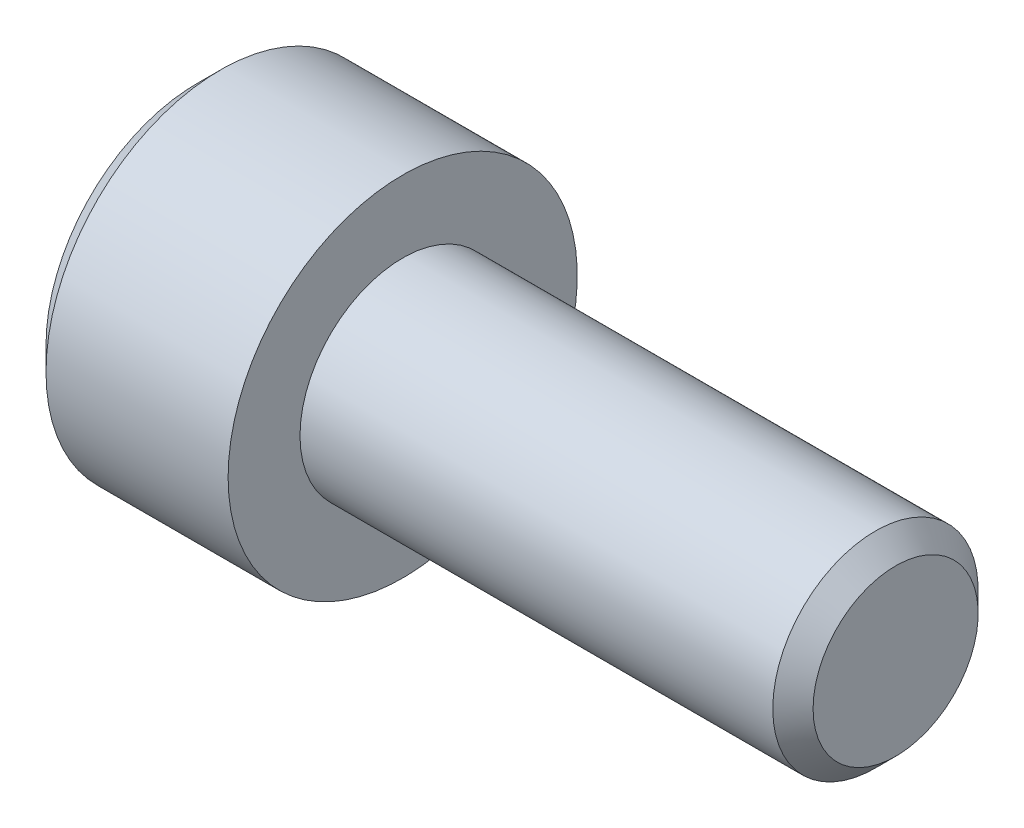
ISO-10303-21;
HEADER;
FILE_DESCRIPTION(('STEP AP214'),'2;1');
FILE_NAME('part.step','',(''),(''),'','','');
FILE_SCHEMA(('AUTOMOTIVE_DESIGN { 1 0 10303 214 1 1 1 1 }'));
ENDSEC;
DATA;
#1=APPLICATION_CONTEXT('core data for automotive mechanical design processes');
#2=APPLICATION_PROTOCOL_DEFINITION('international standard','automotive_design',2000,#1);
#3=PRODUCT_CONTEXT('',#1,'mechanical');
#4=PRODUCT('Part','Part','',(#3));
#5=PRODUCT_RELATED_PRODUCT_CATEGORY('part','',(#4));
#6=PRODUCT_DEFINITION_FORMATION('','',#4);
#7=PRODUCT_DEFINITION_CONTEXT('part definition',#1,'design');
#8=PRODUCT_DEFINITION('design','',#6,#7);
#9=PRODUCT_DEFINITION_SHAPE('','',#8);
#10=(LENGTH_UNIT() NAMED_UNIT(*) SI_UNIT(.MILLI.,.METRE.));
#11=(NAMED_UNIT(*) PLANE_ANGLE_UNIT() SI_UNIT($,.RADIAN.));
#12=(NAMED_UNIT(*) SI_UNIT($,.STERADIAN.) SOLID_ANGLE_UNIT());
#13=UNCERTAINTY_MEASURE_WITH_UNIT(LENGTH_MEASURE(1.E-05),#10,'distance_accuracy_value','');
#14=(GEOMETRIC_REPRESENTATION_CONTEXT(3) GLOBAL_UNCERTAINTY_ASSIGNED_CONTEXT((#13)) GLOBAL_UNIT_ASSIGNED_CONTEXT((#10,
#11,#12)) REPRESENTATION_CONTEXT('',''));
#15=CARTESIAN_POINT('',(0.,0.,0.));
#16=DIRECTION('',(0.,0.,1.));
#17=DIRECTION('',(1.,0.,0.));
#18=AXIS2_PLACEMENT_3D('',#15,#16,#17);
#19=CARTESIAN_POINT('',(-5.,0.,0.));
#20=DIRECTION('',(1.,0.,0.));
#21=DIRECTION('',(0.,0.,-1.));
#22=AXIS2_PLACEMENT_3D('',#19,#20,#21);
#23=PLANE('',#22);
#24=CARTESIAN_POINT('',(-5.,0.,0.));
#25=DIRECTION('',(-1.,0.,0.));
#26=DIRECTION('',(0.,0.,1.));
#27=AXIS2_PLACEMENT_3D('',#24,#25,#26);
#28=CIRCLE('',#27,3.68333333333333);
#29=CARTESIAN_POINT('',(-5.,0.,3.68333333333333));
#30=VERTEX_POINT('',#29);
#31=EDGE_CURVE('E11',#30,#30,#28,.T.);
#32=ORIENTED_EDGE('',*,*,#31,.T.);
#33=EDGE_LOOP('',(#32));
#34=FACE_BOUND('',#33,.T.);
#35=DIRECTION('',(0.,-0.5,-0.866025403784439));
#36=VECTOR('',#35,1.);
#37=CARTESIAN_POINT('',(-5.,-1.15470053837925,2.));
#38=LINE('',#37,#36);
#39=CARTESIAN_POINT('',(-5.,-1.15470053837925,2.));
#40=VERTEX_POINT('',#39);
#41=CARTESIAN_POINT('',(-5.,-2.3094010767585,0.));
#42=VERTEX_POINT('',#41);
#43=EDGE_CURVE('E202',#40,#42,#38,.T.);
#44=ORIENTED_EDGE('',*,*,#43,.T.);
#45=DIRECTION('',(0.,0.5,-0.866025403784439));
#46=VECTOR('',#45,1.);
#47=CARTESIAN_POINT('',(-5.,-2.3094010767585,0.));
#48=LINE('',#47,#46);
#49=CARTESIAN_POINT('',(-5.,-1.15470053837925,-2.));
#50=VERTEX_POINT('',#49);
#51=EDGE_CURVE('E205',#42,#50,#48,.T.);
#52=ORIENTED_EDGE('',*,*,#51,.T.);
#53=DIRECTION('',(0.,1.,0.));
#54=VECTOR('',#53,1.);
#55=CARTESIAN_POINT('',(-5.,-1.15470053837925,-2.));
#56=LINE('',#55,#54);
#57=CARTESIAN_POINT('',(-5.,1.15470053837925,-2.));
#58=VERTEX_POINT('',#57);
#59=EDGE_CURVE('E217',#50,#58,#56,.T.);
#60=ORIENTED_EDGE('',*,*,#59,.T.);
#61=DIRECTION('',(0.,0.5,0.866025403784439));
#62=VECTOR('',#61,1.);
#63=CARTESIAN_POINT('',(-5.,1.15470053837925,-2.));
#64=LINE('',#63,#62);
#65=CARTESIAN_POINT('',(-5.,2.3094010767585,0.));
#66=VERTEX_POINT('',#65);
#67=EDGE_CURVE('E119',#58,#66,#64,.T.);
#68=ORIENTED_EDGE('',*,*,#67,.T.);
#69=DIRECTION('',(0.,-0.5,0.866025403784439));
#70=VECTOR('',#69,1.);
#71=CARTESIAN_POINT('',(-5.,2.3094010767585,0.));
#72=LINE('',#71,#70);
#73=CARTESIAN_POINT('',(-5.,1.15470053837925,2.));
#74=VERTEX_POINT('',#73);
#75=EDGE_CURVE('E241',#66,#74,#72,.T.);
#76=ORIENTED_EDGE('',*,*,#75,.T.);
#77=DIRECTION('',(0.,-1.,0.));
#78=VECTOR('',#77,1.);
#79=CARTESIAN_POINT('',(-5.,1.15470053837925,2.));
#80=LINE('',#79,#78);
#81=EDGE_CURVE('E134',#74,#40,#80,.T.);
#82=ORIENTED_EDGE('',*,*,#81,.T.);
#83=EDGE_LOOP('',(#44,#52,#60,#68,#76,#82));
#84=FACE_BOUND('',#83,.T.);
#85=ADVANCED_FACE('F36',(#34,#84),#23,.F.);
#86=CARTESIAN_POINT('',(-4.43333333333333,0.,0.));
#87=DIRECTION('',(1.,0.,0.));
#88=DIRECTION('',(0.,0.,-1.));
#89=AXIS2_PLACEMENT_3D('',#86,#87,#88);
#90=CONICAL_SURFACE('',#89,4.25,0.785398163397448);
#91=ORIENTED_EDGE('',*,*,#31,.F.);
#92=EDGE_LOOP('',(#91));
#93=FACE_BOUND('',#92,.T.);
#94=CARTESIAN_POINT('',(-4.43333333333333,0.,0.));
#95=DIRECTION('',(-1.,0.,0.));
#96=DIRECTION('',(0.,0.,1.));
#97=AXIS2_PLACEMENT_3D('',#94,#95,#96);
#98=CIRCLE('',#97,4.25);
#99=CARTESIAN_POINT('',(-4.43333333333333,0.,4.25));
#100=VERTEX_POINT('',#99);
#101=EDGE_CURVE('E43',#100,#100,#98,.T.);
#102=ORIENTED_EDGE('',*,*,#101,.T.);
#103=EDGE_LOOP('',(#102));
#104=FACE_BOUND('',#103,.T.);
#105=ADVANCED_FACE('F159',(#93,#104),#90,.T.);
#106=CARTESIAN_POINT('',(12.,0.,0.));
#107=DIRECTION('',(-1.,0.,0.));
#108=DIRECTION('',(0.,0.,1.));
#109=AXIS2_PLACEMENT_3D('',#106,#107,#108);
#110=CYLINDRICAL_SURFACE('',#109,4.25);
#111=ORIENTED_EDGE('',*,*,#101,.F.);
#112=EDGE_LOOP('',(#111));
#113=FACE_BOUND('',#112,.T.);
#114=CARTESIAN_POINT('',(0.,0.,0.));
#115=DIRECTION('',(-1.,0.,0.));
#116=DIRECTION('',(0.,0.,1.));
#117=AXIS2_PLACEMENT_3D('',#114,#115,#116);
#118=CIRCLE('',#117,4.25);
#119=CARTESIAN_POINT('',(0.,0.,4.25));
#120=VERTEX_POINT('',#119);
#121=EDGE_CURVE('E154',#120,#120,#118,.T.);
#122=ORIENTED_EDGE('',*,*,#121,.T.);
#123=EDGE_LOOP('',(#122));
#124=FACE_BOUND('',#123,.T.);
#125=ADVANCED_FACE('F161',(#113,#124),#110,.T.);
#126=CARTESIAN_POINT('',(0.,4.25,0.));
#127=DIRECTION('',(-1.,0.,0.));
#128=DIRECTION('',(0.,0.,1.));
#129=AXIS2_PLACEMENT_3D('',#126,#127,#128);
#130=PLANE('',#129);
#131=ORIENTED_EDGE('',*,*,#121,.F.);
#132=EDGE_LOOP('',(#131));
#133=FACE_BOUND('',#132,.T.);
#134=CARTESIAN_POINT('',(0.,0.,0.));
#135=DIRECTION('',(-1.,0.,0.));
#136=DIRECTION('',(0.,0.,1.));
#137=AXIS2_PLACEMENT_3D('',#134,#135,#136);
#138=CIRCLE('',#137,2.5);
#139=CARTESIAN_POINT('',(0.,0.,2.5));
#140=VERTEX_POINT('',#139);
#141=EDGE_CURVE('E151',#140,#140,#138,.T.);
#142=ORIENTED_EDGE('',*,*,#141,.T.);
#143=EDGE_LOOP('',(#142));
#144=FACE_BOUND('',#143,.T.);
#145=ADVANCED_FACE('F164',(#133,#144),#130,.F.);
#146=CARTESIAN_POINT('',(12.,0.,0.));
#147=DIRECTION('',(-1.,0.,0.));
#148=DIRECTION('',(0.,0.,1.));
#149=AXIS2_PLACEMENT_3D('',#146,#147,#148);
#150=CYLINDRICAL_SURFACE('',#149,2.5);
#151=ORIENTED_EDGE('',*,*,#141,.F.);
#152=EDGE_LOOP('',(#151));
#153=FACE_BOUND('',#152,.T.);
#154=CARTESIAN_POINT('',(11.5095,0.,0.));
#155=DIRECTION('',(-1.,0.,0.));
#156=DIRECTION('',(0.,0.,1.));
#157=AXIS2_PLACEMENT_3D('',#154,#155,#156);
#158=CIRCLE('',#157,2.5);
#159=CARTESIAN_POINT('',(11.5095,0.,2.5));
#160=VERTEX_POINT('',#159);
#161=EDGE_CURVE('E148',#160,#160,#158,.T.);
#162=ORIENTED_EDGE('',*,*,#161,.T.);
#163=EDGE_LOOP('',(#162));
#164=FACE_BOUND('',#163,.T.);
#165=ADVANCED_FACE('F170',(#153,#164),#150,.T.);
#166=CARTESIAN_POINT('',(12.,0.,0.));
#167=DIRECTION('',(-1.,0.,0.));
#168=DIRECTION('',(0.,0.,1.));
#169=AXIS2_PLACEMENT_3D('',#166,#167,#168);
#170=CONICAL_SURFACE('',#169,2.0095,0.785398163397448);
#171=ORIENTED_EDGE('',*,*,#161,.F.);
#172=EDGE_LOOP('',(#171));
#173=FACE_BOUND('',#172,.T.);
#174=CARTESIAN_POINT('',(12.,0.,0.));
#175=DIRECTION('',(-1.,0.,0.));
#176=DIRECTION('',(0.,0.,1.));
#177=AXIS2_PLACEMENT_3D('',#174,#175,#176);
#178=CIRCLE('',#177,2.0095);
#179=CARTESIAN_POINT('',(12.,0.,2.0095));
#180=VERTEX_POINT('',#179);
#181=EDGE_CURVE('E144',#180,#180,#178,.T.);
#182=ORIENTED_EDGE('',*,*,#181,.T.);
#183=EDGE_LOOP('',(#182));
#184=FACE_BOUND('',#183,.T.);
#185=ADVANCED_FACE('F176',(#173,#184),#170,.T.);
#186=CARTESIAN_POINT('',(12.,2.0095,0.));
#187=DIRECTION('',(-1.,0.,0.));
#188=DIRECTION('',(0.,0.,1.));
#189=AXIS2_PLACEMENT_3D('',#186,#187,#188);
#190=PLANE('',#189);
#191=ORIENTED_EDGE('',*,*,#181,.F.);
#192=EDGE_LOOP('',(#191));
#193=FACE_BOUND('',#192,.T.);
#194=ADVANCED_FACE('F182',(#193),#190,.F.);
#195=CARTESIAN_POINT('',(-2.5,2.3094010767585,0.));
#196=DIRECTION('',(0.,-0.866025403784439,-0.5));
#197=DIRECTION('',(0.,0.5,-0.866025403784439));
#198=AXIS2_PLACEMENT_3D('',#195,#196,#197);
#199=PLANE('',#198);
#200=DIRECTION('',(0.,-0.5,0.866025403784439));
#201=VECTOR('',#200,1.);
#202=CARTESIAN_POINT('',(-2.5,2.3094010767585,0.));
#203=LINE('',#202,#201);
#204=CARTESIAN_POINT('',(-2.5,2.3094010767585,0.));
#205=VERTEX_POINT('',#204);
#206=CARTESIAN_POINT('',(-2.5,1.73205080756888,1.));
#207=VERTEX_POINT('',#206);
#208=EDGE_CURVE('E116',#205,#207,#203,.T.);
#209=ORIENTED_EDGE('',*,*,#208,.T.);
#210=CARTESIAN_POINT('',(-2.5,1.15470053837925,2.));
#211=VERTEX_POINT('',#210);
#212=EDGE_CURVE('E108',#207,#211,#203,.T.);
#213=ORIENTED_EDGE('',*,*,#212,.T.);
#214=DIRECTION('',(-1.,0.,0.));
#215=VECTOR('',#214,1.);
#216=CARTESIAN_POINT('',(-2.5,1.15470053837925,2.));
#217=LINE('',#216,#215);
#218=EDGE_CURVE('E113',#211,#74,#217,.T.);
#219=ORIENTED_EDGE('',*,*,#218,.T.);
#220=ORIENTED_EDGE('',*,*,#75,.F.);
#221=DIRECTION('',(-1.,0.,0.));
#222=VECTOR('',#221,1.);
#223=CARTESIAN_POINT('',(-2.5,2.3094010767585,0.));
#224=LINE('',#223,#222);
#225=EDGE_CURVE('E223',#205,#66,#224,.T.);
#226=ORIENTED_EDGE('',*,*,#225,.F.);
#227=EDGE_LOOP('',(#209,#213,#219,#220,#226));
#228=FACE_BOUND('',#227,.T.);
#229=ADVANCED_FACE('F110',(#228),#199,.T.);
#230=CARTESIAN_POINT('',(-2.5,1.15470053837925,2.));
#231=DIRECTION('',(0.,0.,-1.));
#232=DIRECTION('',(-1.,0.,0.));
#233=AXIS2_PLACEMENT_3D('',#230,#231,#232);
#234=PLANE('',#233);
#235=DIRECTION('',(0.,-1.,0.));
#236=VECTOR('',#235,1.);
#237=CARTESIAN_POINT('',(-2.5,1.15470053837925,2.));
#238=LINE('',#237,#236);
#239=CARTESIAN_POINT('',(-2.5,0.,2.));
#240=VERTEX_POINT('',#239);
#241=EDGE_CURVE('E122',#211,#240,#238,.T.);
#242=ORIENTED_EDGE('',*,*,#241,.T.);
#243=CARTESIAN_POINT('',(-2.5,-1.15470053837925,2.));
#244=VERTEX_POINT('',#243);
#245=EDGE_CURVE('E129',#240,#244,#238,.T.);
#246=ORIENTED_EDGE('',*,*,#245,.T.);
#247=DIRECTION('',(-1.,0.,0.));
#248=VECTOR('',#247,1.);
#249=CARTESIAN_POINT('',(-2.5,-1.15470053837925,2.));
#250=LINE('',#249,#248);
#251=EDGE_CURVE('E136',#244,#40,#250,.T.);
#252=ORIENTED_EDGE('',*,*,#251,.T.);
#253=ORIENTED_EDGE('',*,*,#81,.F.);
#254=ORIENTED_EDGE('',*,*,#218,.F.);
#255=EDGE_LOOP('',(#242,#246,#252,#253,#254));
#256=FACE_BOUND('',#255,.T.);
#257=ADVANCED_FACE('F132',(#256),#234,.T.);
#258=CARTESIAN_POINT('',(-2.5,-1.15470053837925,2.));
#259=DIRECTION('',(0.,0.866025403784439,-0.5));
#260=DIRECTION('',(0.,0.5,0.866025403784439));
#261=AXIS2_PLACEMENT_3D('',#258,#259,#260);
#262=PLANE('',#261);
#263=DIRECTION('',(0.,-0.5,-0.866025403784439));
#264=VECTOR('',#263,1.);
#265=CARTESIAN_POINT('',(-2.5,-1.15470053837925,2.));
#266=LINE('',#265,#264);
#267=CARTESIAN_POINT('',(-2.5,-1.73205080756888,1.));
#268=VERTEX_POINT('',#267);
#269=EDGE_CURVE('E250',#244,#268,#266,.T.);
#270=ORIENTED_EDGE('',*,*,#269,.T.);
#271=CARTESIAN_POINT('',(-2.5,-2.3094010767585,0.));
#272=VERTEX_POINT('',#271);
#273=EDGE_CURVE('E128',#268,#272,#266,.T.);
#274=ORIENTED_EDGE('',*,*,#273,.T.);
#275=DIRECTION('',(-1.,0.,0.));
#276=VECTOR('',#275,1.);
#277=CARTESIAN_POINT('',(-2.5,-2.3094010767585,0.));
#278=LINE('',#277,#276);
#279=EDGE_CURVE('E140',#272,#42,#278,.T.);
#280=ORIENTED_EDGE('',*,*,#279,.T.);
#281=ORIENTED_EDGE('',*,*,#43,.F.);
#282=ORIENTED_EDGE('',*,*,#251,.F.);
#283=EDGE_LOOP('',(#270,#274,#280,#281,#282));
#284=FACE_BOUND('',#283,.T.);
#285=ADVANCED_FACE('F211',(#284),#262,.T.);
#286=CARTESIAN_POINT('',(-2.5,-2.3094010767585,0.));
#287=DIRECTION('',(0.,0.866025403784439,0.5));
#288=DIRECTION('',(0.,-0.5,0.866025403784439));
#289=AXIS2_PLACEMENT_3D('',#286,#287,#288);
#290=PLANE('',#289);
#291=DIRECTION('',(0.,0.5,-0.866025403784439));
#292=VECTOR('',#291,1.);
#293=CARTESIAN_POINT('',(-2.5,-2.3094010767585,0.));
#294=LINE('',#293,#292);
#295=CARTESIAN_POINT('',(-2.5,-1.73205080756888,-1.));
#296=VERTEX_POINT('',#295);
#297=EDGE_CURVE('E50',#272,#296,#294,.T.);
#298=ORIENTED_EDGE('',*,*,#297,.T.);
#299=CARTESIAN_POINT('',(-2.5,-1.15470053837925,-2.));
#300=VERTEX_POINT('',#299);
#301=EDGE_CURVE('E249',#296,#300,#294,.T.);
#302=ORIENTED_EDGE('',*,*,#301,.T.);
#303=DIRECTION('',(-1.,0.,0.));
#304=VECTOR('',#303,1.);
#305=CARTESIAN_POINT('',(-2.5,-1.15470053837925,-2.));
#306=LINE('',#305,#304);
#307=EDGE_CURVE('E213',#300,#50,#306,.T.);
#308=ORIENTED_EDGE('',*,*,#307,.T.);
#309=ORIENTED_EDGE('',*,*,#51,.F.);
#310=ORIENTED_EDGE('',*,*,#279,.F.);
#311=EDGE_LOOP('',(#298,#302,#308,#309,#310));
#312=FACE_BOUND('',#311,.T.);
#313=ADVANCED_FACE('F214',(#312),#290,.T.);
#314=CARTESIAN_POINT('',(-2.5,-1.15470053837925,-2.));
#315=DIRECTION('',(0.,0.,1.));
#316=DIRECTION('',(1.,0.,0.));
#317=AXIS2_PLACEMENT_3D('',#314,#315,#316);
#318=PLANE('',#317);
#319=DIRECTION('',(0.,1.,0.));
#320=VECTOR('',#319,1.);
#321=CARTESIAN_POINT('',(-2.5,-1.15470053837925,-2.));
#322=LINE('',#321,#320);
#323=CARTESIAN_POINT('',(-2.5,0.,-2.));
#324=VERTEX_POINT('',#323);
#325=EDGE_CURVE('E246',#300,#324,#322,.T.);
#326=ORIENTED_EDGE('',*,*,#325,.T.);
#327=CARTESIAN_POINT('',(-2.5,1.15470053837925,-2.));
#328=VERTEX_POINT('',#327);
#329=EDGE_CURVE('E236',#324,#328,#322,.T.);
#330=ORIENTED_EDGE('',*,*,#329,.T.);
#331=DIRECTION('',(-1.,0.,0.));
#332=VECTOR('',#331,1.);
#333=CARTESIAN_POINT('',(-2.5,1.15470053837925,-2.));
#334=LINE('',#333,#332);
#335=EDGE_CURVE('E226',#328,#58,#334,.T.);
#336=ORIENTED_EDGE('',*,*,#335,.T.);
#337=ORIENTED_EDGE('',*,*,#59,.F.);
#338=ORIENTED_EDGE('',*,*,#307,.F.);
#339=EDGE_LOOP('',(#326,#330,#336,#337,#338));
#340=FACE_BOUND('',#339,.T.);
#341=ADVANCED_FACE('F234',(#340),#318,.T.);
#342=CARTESIAN_POINT('',(-2.5,1.15470053837925,-2.));
#343=DIRECTION('',(0.,-0.866025403784439,0.5));
#344=DIRECTION('',(0.,-0.5,-0.866025403784439));
#345=AXIS2_PLACEMENT_3D('',#342,#343,#344);
#346=PLANE('',#345);
#347=DIRECTION('',(0.,0.5,0.866025403784439));
#348=VECTOR('',#347,1.);
#349=CARTESIAN_POINT('',(-2.5,1.15470053837925,-2.));
#350=LINE('',#349,#348);
#351=CARTESIAN_POINT('',(-2.5,1.73205080756888,-1.));
#352=VERTEX_POINT('',#351);
#353=EDGE_CURVE('E227',#328,#352,#350,.T.);
#354=ORIENTED_EDGE('',*,*,#353,.T.);
#355=EDGE_CURVE('E245',#352,#205,#350,.T.);
#356=ORIENTED_EDGE('',*,*,#355,.T.);
#357=ORIENTED_EDGE('',*,*,#225,.T.);
#358=ORIENTED_EDGE('',*,*,#67,.F.);
#359=ORIENTED_EDGE('',*,*,#335,.F.);
#360=EDGE_LOOP('',(#354,#356,#357,#358,#359));
#361=FACE_BOUND('',#360,.T.);
#362=ADVANCED_FACE('F240',(#361),#346,.T.);
#363=CARTESIAN_POINT('',(-2.5,0.,0.));
#364=DIRECTION('',(1.,0.,0.));
#365=DIRECTION('',(0.,0.,-1.));
#366=AXIS2_PLACEMENT_3D('',#363,#364,#365);
#367=PLANE('',#366);
#368=CARTESIAN_POINT('',(-2.5,0.,0.));
#369=DIRECTION('',(-1.,0.,0.));
#370=DIRECTION('',(0.,0.,1.));
#371=AXIS2_PLACEMENT_3D('',#368,#369,#370);
#372=CIRCLE('',#371,2.);
#373=EDGE_CURVE('E264',#352,#324,#372,.T.);
#374=ORIENTED_EDGE('',*,*,#373,.F.);
#375=ORIENTED_EDGE('',*,*,#353,.F.);
#376=ORIENTED_EDGE('',*,*,#329,.F.);
#377=EDGE_LOOP('',(#374,#375,#376));
#378=FACE_BOUND('',#377,.T.);
#379=ADVANCED_FACE('F271',(#378),#367,.F.);
#380=EDGE_CURVE('E145',#207,#352,#372,.T.);
#381=ORIENTED_EDGE('',*,*,#380,.F.);
#382=ORIENTED_EDGE('',*,*,#208,.F.);
#383=ORIENTED_EDGE('',*,*,#355,.F.);
#384=EDGE_LOOP('',(#381,#382,#383));
#385=FACE_BOUND('',#384,.T.);
#386=ADVANCED_FACE('F269',(#385),#367,.F.);
#387=EDGE_CURVE('E124',#240,#207,#372,.T.);
#388=ORIENTED_EDGE('',*,*,#387,.F.);
#389=ORIENTED_EDGE('',*,*,#241,.F.);
#390=ORIENTED_EDGE('',*,*,#212,.F.);
#391=EDGE_LOOP('',(#388,#389,#390));
#392=FACE_BOUND('',#391,.T.);
#393=ADVANCED_FACE('F123',(#392),#367,.F.);
#394=EDGE_CURVE('E135',#268,#240,#372,.T.);
#395=ORIENTED_EDGE('',*,*,#394,.F.);
#396=ORIENTED_EDGE('',*,*,#269,.F.);
#397=ORIENTED_EDGE('',*,*,#245,.F.);
#398=EDGE_LOOP('',(#395,#396,#397));
#399=FACE_BOUND('',#398,.T.);
#400=ADVANCED_FACE('F254',(#399),#367,.F.);
#401=EDGE_CURVE('E138',#296,#268,#372,.T.);
#402=ORIENTED_EDGE('',*,*,#401,.F.);
#403=ORIENTED_EDGE('',*,*,#297,.F.);
#404=ORIENTED_EDGE('',*,*,#273,.F.);
#405=EDGE_LOOP('',(#402,#403,#404));
#406=FACE_BOUND('',#405,.T.);
#407=ADVANCED_FACE('F258',(#406),#367,.F.);
#408=EDGE_CURVE('E260',#324,#296,#372,.T.);
#409=ORIENTED_EDGE('',*,*,#408,.F.);
#410=ORIENTED_EDGE('',*,*,#325,.F.);
#411=ORIENTED_EDGE('',*,*,#301,.F.);
#412=EDGE_LOOP('',(#409,#410,#411));
#413=FACE_BOUND('',#412,.T.);
#414=ADVANCED_FACE('F272',(#413),#367,.F.);
#415=CARTESIAN_POINT('',(-1.96410161513776,0.,0.));
#416=DIRECTION('',(-1.,0.,0.));
#417=DIRECTION('',(0.,0.,1.));
#418=AXIS2_PLACEMENT_3D('',#415,#416,#417);
#419=CONICAL_SURFACE('',#418,0.,1.30899693899575);
#420=ORIENTED_EDGE('',*,*,#387,.T.);
#421=ORIENTED_EDGE('',*,*,#380,.T.);
#422=ORIENTED_EDGE('',*,*,#373,.T.);
#423=ORIENTED_EDGE('',*,*,#408,.T.);
#424=ORIENTED_EDGE('',*,*,#401,.T.);
#425=ORIENTED_EDGE('',*,*,#394,.T.);
#426=EDGE_LOOP('',(#420,#421,#422,#423,#424,#425));
#427=FACE_BOUND('',#426,.T.);
#428=CARTESIAN_POINT('',(-1.96410161513776,0.,0.));
#429=VERTEX_POINT('',#428);
#430=VERTEX_LOOP('',#429);
#431=FACE_BOUND('',#430,.T.);
#432=ADVANCED_FACE('F262',(#427,#431),#419,.F.);
#433=CLOSED_SHELL('',(#85,#105,#125,#145,#165,#185,#194,#229,#257,#285,#313,#341,#362,#379,#386,
#393,#400,#407,#414,#432));
#434=MANIFOLD_SOLID_BREP('B2',#433);
#435=ADVANCED_BREP_SHAPE_REPRESENTATION('',(#18,#434),#14);
#436=SHAPE_DEFINITION_REPRESENTATION(#9,#435);
ENDSEC;
END-ISO-10303-21;
